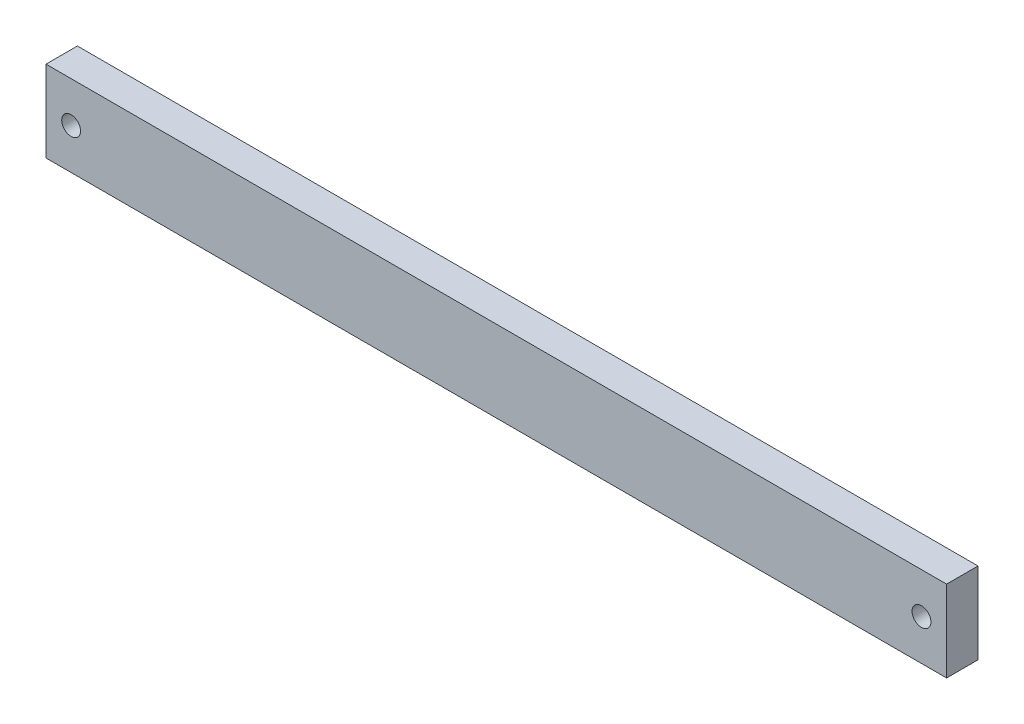
ISO-10303-21;
HEADER;
FILE_DESCRIPTION(('STEP AP214'),'2;1');
FILE_NAME('part.step','',(''),(''),'','','');
FILE_SCHEMA(('AUTOMOTIVE_DESIGN { 1 0 10303 214 1 1 1 1 }'));
ENDSEC;
DATA;
#1=APPLICATION_CONTEXT('core data for automotive mechanical design processes');
#2=APPLICATION_PROTOCOL_DEFINITION('international standard','automotive_design',2000,#1);
#3=PRODUCT_CONTEXT('',#1,'mechanical');
#4=PRODUCT('Part','Part','',(#3));
#5=PRODUCT_RELATED_PRODUCT_CATEGORY('part','',(#4));
#6=PRODUCT_DEFINITION_FORMATION('','',#4);
#7=PRODUCT_DEFINITION_CONTEXT('part definition',#1,'design');
#8=PRODUCT_DEFINITION('design','',#6,#7);
#9=PRODUCT_DEFINITION_SHAPE('','',#8);
#10=(LENGTH_UNIT() NAMED_UNIT(*) SI_UNIT(.MILLI.,.METRE.));
#11=(NAMED_UNIT(*) PLANE_ANGLE_UNIT() SI_UNIT($,.RADIAN.));
#12=(NAMED_UNIT(*) SI_UNIT($,.STERADIAN.) SOLID_ANGLE_UNIT());
#13=UNCERTAINTY_MEASURE_WITH_UNIT(LENGTH_MEASURE(1.E-05),#10,'distance_accuracy_value','');
#14=(GEOMETRIC_REPRESENTATION_CONTEXT(3) GLOBAL_UNCERTAINTY_ASSIGNED_CONTEXT((#13)) GLOBAL_UNIT_ASSIGNED_CONTEXT((#10,
#11,#12)) REPRESENTATION_CONTEXT('',''));
#15=CARTESIAN_POINT('',(0.,0.,0.));
#16=DIRECTION('',(0.,0.,1.));
#17=DIRECTION('',(1.,0.,0.));
#18=AXIS2_PLACEMENT_3D('',#15,#16,#17);
#19=CARTESIAN_POINT('',(358.5,32.3702185792349,25.));
#20=DIRECTION('',(-1.,0.,0.));
#21=DIRECTION('',(0.,0.,1.));
#22=AXIS2_PLACEMENT_3D('',#19,#20,#21);
#23=PLANE('',#22);
#24=DIRECTION('',(0.,1.,0.));
#25=VECTOR('',#24,1.);
#26=CARTESIAN_POINT('',(358.5,32.3702185792349,0.));
#27=LINE('',#26,#25);
#28=CARTESIAN_POINT('',(358.5,-32.3702185792349,0.));
#29=VERTEX_POINT('',#28);
#30=CARTESIAN_POINT('',(358.5,32.3702185792349,0.));
#31=VERTEX_POINT('',#30);
#32=EDGE_CURVE('E100',#29,#31,#27,.T.);
#33=ORIENTED_EDGE('',*,*,#32,.T.);
#34=DIRECTION('',(0.,0.,-1.));
#35=VECTOR('',#34,1.);
#36=CARTESIAN_POINT('',(358.5,32.3702185792349,25.));
#37=LINE('',#36,#35);
#38=CARTESIAN_POINT('',(358.5,32.3702185792349,25.));
#39=VERTEX_POINT('',#38);
#40=EDGE_CURVE('E11',#39,#31,#37,.T.);
#41=ORIENTED_EDGE('',*,*,#40,.F.);
#42=DIRECTION('',(0.,1.,0.));
#43=VECTOR('',#42,1.);
#44=CARTESIAN_POINT('',(358.5,32.3702185792349,25.));
#45=LINE('',#44,#43);
#46=CARTESIAN_POINT('',(358.5,-32.3702185792349,25.));
#47=VERTEX_POINT('',#46);
#48=EDGE_CURVE('E87',#47,#39,#45,.T.);
#49=ORIENTED_EDGE('',*,*,#48,.F.);
#50=DIRECTION('',(0.,0.,-1.));
#51=VECTOR('',#50,1.);
#52=CARTESIAN_POINT('',(358.5,-32.3702185792349,25.));
#53=LINE('',#52,#51);
#54=EDGE_CURVE('E96',#47,#29,#53,.T.);
#55=ORIENTED_EDGE('',*,*,#54,.T.);
#56=EDGE_LOOP('',(#33,#41,#49,#55));
#57=FACE_BOUND('',#56,.T.);
#58=ADVANCED_FACE('F34',(#57),#23,.F.);
#59=CARTESIAN_POINT('',(-358.5,32.3702185792349,25.));
#60=DIRECTION('',(0.,-1.,0.));
#61=DIRECTION('',(0.,0.,-1.));
#62=AXIS2_PLACEMENT_3D('',#59,#60,#61);
#63=PLANE('',#62);
#64=DIRECTION('',(-1.,0.,0.));
#65=VECTOR('',#64,1.);
#66=CARTESIAN_POINT('',(-358.5,32.3702185792349,0.));
#67=LINE('',#66,#65);
#68=CARTESIAN_POINT('',(-358.5,32.3702185792349,0.));
#69=VERTEX_POINT('',#68);
#70=EDGE_CURVE('E91',#31,#69,#67,.T.);
#71=ORIENTED_EDGE('',*,*,#70,.T.);
#72=DIRECTION('',(0.,0.,-1.));
#73=VECTOR('',#72,1.);
#74=CARTESIAN_POINT('',(-358.5,32.3702185792349,25.));
#75=LINE('',#74,#73);
#76=CARTESIAN_POINT('',(-358.5,32.3702185792349,25.));
#77=VERTEX_POINT('',#76);
#78=EDGE_CURVE('E43',#77,#69,#75,.T.);
#79=ORIENTED_EDGE('',*,*,#78,.F.);
#80=DIRECTION('',(-1.,0.,0.));
#81=VECTOR('',#80,1.);
#82=CARTESIAN_POINT('',(-358.5,32.3702185792349,25.));
#83=LINE('',#82,#81);
#84=EDGE_CURVE('E82',#39,#77,#83,.T.);
#85=ORIENTED_EDGE('',*,*,#84,.F.);
#86=ORIENTED_EDGE('',*,*,#40,.T.);
#87=EDGE_LOOP('',(#71,#79,#85,#86));
#88=FACE_BOUND('',#87,.T.);
#89=ADVANCED_FACE('F90',(#88),#63,.F.);
#90=CARTESIAN_POINT('',(-358.5,32.3702185792349,25.));
#91=DIRECTION('',(1.,0.,0.));
#92=DIRECTION('',(0.,0.,-1.));
#93=AXIS2_PLACEMENT_3D('',#90,#91,#92);
#94=PLANE('',#93);
#95=DIRECTION('',(0.,-1.,0.));
#96=VECTOR('',#95,1.);
#97=CARTESIAN_POINT('',(-358.5,32.3702185792349,0.));
#98=LINE('',#97,#96);
#99=CARTESIAN_POINT('',(-358.5,-32.3702185792349,0.));
#100=VERTEX_POINT('',#99);
#101=EDGE_CURVE('E69',#69,#100,#98,.T.);
#102=ORIENTED_EDGE('',*,*,#101,.T.);
#103=DIRECTION('',(0.,0.,-1.));
#104=VECTOR('',#103,1.);
#105=CARTESIAN_POINT('',(-358.5,-32.3702185792349,25.));
#106=LINE('',#105,#104);
#107=CARTESIAN_POINT('',(-358.5,-32.3702185792349,25.));
#108=VERTEX_POINT('',#107);
#109=EDGE_CURVE('E92',#108,#100,#106,.T.);
#110=ORIENTED_EDGE('',*,*,#109,.F.);
#111=DIRECTION('',(0.,-1.,0.));
#112=VECTOR('',#111,1.);
#113=CARTESIAN_POINT('',(-358.5,32.3702185792349,25.));
#114=LINE('',#113,#112);
#115=EDGE_CURVE('E85',#77,#108,#114,.T.);
#116=ORIENTED_EDGE('',*,*,#115,.F.);
#117=ORIENTED_EDGE('',*,*,#78,.T.);
#118=EDGE_LOOP('',(#102,#110,#116,#117));
#119=FACE_BOUND('',#118,.T.);
#120=ADVANCED_FACE('F94',(#119),#94,.F.);
#121=CARTESIAN_POINT('',(-358.5,-32.3702185792349,25.));
#122=DIRECTION('',(0.,1.,0.));
#123=DIRECTION('',(-1.,0.,0.));
#124=AXIS2_PLACEMENT_3D('',#121,#122,#123);
#125=PLANE('',#124);
#126=DIRECTION('',(1.,0.,0.));
#127=VECTOR('',#126,1.);
#128=CARTESIAN_POINT('',(-358.5,-32.3702185792349,0.));
#129=LINE('',#128,#127);
#130=EDGE_CURVE('E75',#100,#29,#129,.T.);
#131=ORIENTED_EDGE('',*,*,#130,.T.);
#132=ORIENTED_EDGE('',*,*,#54,.F.);
#133=DIRECTION('',(1.,0.,0.));
#134=VECTOR('',#133,1.);
#135=CARTESIAN_POINT('',(-358.5,-32.3702185792349,25.));
#136=LINE('',#135,#134);
#137=EDGE_CURVE('E52',#108,#47,#136,.T.);
#138=ORIENTED_EDGE('',*,*,#137,.F.);
#139=ORIENTED_EDGE('',*,*,#109,.T.);
#140=EDGE_LOOP('',(#131,#132,#138,#139));
#141=FACE_BOUND('',#140,.T.);
#142=ADVANCED_FACE('F145',(#141),#125,.F.);
#143=CARTESIAN_POINT('',(0.,0.,25.));
#144=DIRECTION('',(0.,0.,1.));
#145=DIRECTION('',(1.,0.,0.));
#146=AXIS2_PLACEMENT_3D('',#143,#144,#145);
#147=PLANE('',#146);
#148=CARTESIAN_POINT('',(338.5,0.,25.));
#149=DIRECTION('',(0.,0.,-1.));
#150=DIRECTION('',(-1.,0.,0.));
#151=AXIS2_PLACEMENT_3D('',#148,#149,#150);
#152=CIRCLE('',#151,7.50000000000001);
#153=CARTESIAN_POINT('',(331.,0.,25.));
#154=VERTEX_POINT('',#153);
#155=EDGE_CURVE('E109',#154,#154,#152,.T.);
#156=ORIENTED_EDGE('',*,*,#155,.T.);
#157=EDGE_LOOP('',(#156));
#158=FACE_BOUND('',#157,.T.);
#159=CARTESIAN_POINT('',(-338.5,0.,25.));
#160=DIRECTION('',(0.,0.,-1.));
#161=DIRECTION('',(-1.,0.,0.));
#162=AXIS2_PLACEMENT_3D('',#159,#160,#161);
#163=CIRCLE('',#162,7.50000000000001);
#164=CARTESIAN_POINT('',(-346.,0.,25.));
#165=VERTEX_POINT('',#164);
#166=EDGE_CURVE('E114',#165,#165,#163,.T.);
#167=ORIENTED_EDGE('',*,*,#166,.T.);
#168=EDGE_LOOP('',(#167));
#169=FACE_BOUND('',#168,.T.);
#170=ORIENTED_EDGE('',*,*,#48,.T.);
#171=ORIENTED_EDGE('',*,*,#84,.T.);
#172=ORIENTED_EDGE('',*,*,#115,.T.);
#173=ORIENTED_EDGE('',*,*,#137,.T.);
#174=EDGE_LOOP('',(#170,#171,#172,#173));
#175=FACE_BOUND('',#174,.T.);
#176=ADVANCED_FACE('F83',(#158,#169,#175),#147,.T.);
#177=CARTESIAN_POINT('',(0.,0.,0.));
#178=DIRECTION('',(0.,0.,1.));
#179=DIRECTION('',(1.,0.,0.));
#180=AXIS2_PLACEMENT_3D('',#177,#178,#179);
#181=PLANE('',#180);
#182=CARTESIAN_POINT('',(338.5,0.,0.));
#183=DIRECTION('',(0.,0.,1.));
#184=DIRECTION('',(1.,0.,0.));
#185=AXIS2_PLACEMENT_3D('',#182,#183,#184);
#186=CIRCLE('',#185,7.50000000000001);
#187=CARTESIAN_POINT('',(346.,0.,0.));
#188=VERTEX_POINT('',#187);
#189=EDGE_CURVE('E37',#188,#188,#186,.T.);
#190=ORIENTED_EDGE('',*,*,#189,.T.);
#191=EDGE_LOOP('',(#190));
#192=FACE_BOUND('',#191,.T.);
#193=CARTESIAN_POINT('',(-338.5,0.,0.));
#194=DIRECTION('',(0.,0.,1.));
#195=DIRECTION('',(1.,0.,0.));
#196=AXIS2_PLACEMENT_3D('',#193,#194,#195);
#197=CIRCLE('',#196,7.50000000000001);
#198=CARTESIAN_POINT('',(-331.,0.,0.));
#199=VERTEX_POINT('',#198);
#200=EDGE_CURVE('E107',#199,#199,#197,.T.);
#201=ORIENTED_EDGE('',*,*,#200,.T.);
#202=EDGE_LOOP('',(#201));
#203=FACE_BOUND('',#202,.T.);
#204=ORIENTED_EDGE('',*,*,#32,.F.);
#205=ORIENTED_EDGE('',*,*,#130,.F.);
#206=ORIENTED_EDGE('',*,*,#101,.F.);
#207=ORIENTED_EDGE('',*,*,#70,.F.);
#208=EDGE_LOOP('',(#204,#205,#206,#207));
#209=FACE_BOUND('',#208,.T.);
#210=ADVANCED_FACE('F127',(#192,#203,#209),#181,.F.);
#211=CARTESIAN_POINT('',(-338.5,0.,25.));
#212=DIRECTION('',(0.,0.,-1.));
#213=DIRECTION('',(-1.,0.,0.));
#214=AXIS2_PLACEMENT_3D('',#211,#212,#213);
#215=CYLINDRICAL_SURFACE('',#214,7.50000000000001);
#216=ORIENTED_EDGE('',*,*,#166,.F.);
#217=EDGE_LOOP('',(#216));
#218=FACE_BOUND('',#217,.T.);
#219=ORIENTED_EDGE('',*,*,#200,.F.);
#220=EDGE_LOOP('',(#219));
#221=FACE_BOUND('',#220,.T.);
#222=ADVANCED_FACE('F123',(#218,#221),#215,.F.);
#223=CARTESIAN_POINT('',(338.5,0.,25.));
#224=DIRECTION('',(0.,0.,-1.));
#225=DIRECTION('',(-1.,0.,0.));
#226=AXIS2_PLACEMENT_3D('',#223,#224,#225);
#227=CYLINDRICAL_SURFACE('',#226,7.50000000000001);
#228=ORIENTED_EDGE('',*,*,#155,.F.);
#229=EDGE_LOOP('',(#228));
#230=FACE_BOUND('',#229,.T.);
#231=ORIENTED_EDGE('',*,*,#189,.F.);
#232=EDGE_LOOP('',(#231));
#233=FACE_BOUND('',#232,.T.);
#234=ADVANCED_FACE('F126',(#230,#233),#227,.F.);
#235=CLOSED_SHELL('',(#58,#89,#120,#142,#176,#210,#222,#234));
#236=MANIFOLD_SOLID_BREP('B2',#235);
#237=ADVANCED_BREP_SHAPE_REPRESENTATION('',(#18,#236),#14);
#238=SHAPE_DEFINITION_REPRESENTATION(#9,#237);
ENDSEC;
END-ISO-10303-21;
